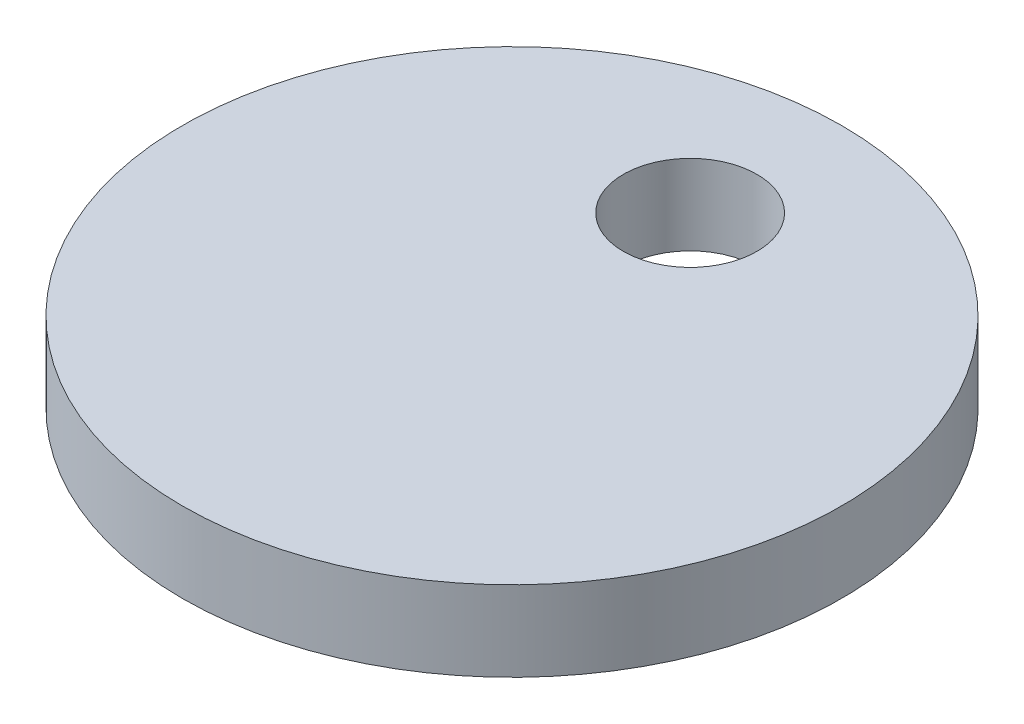
ISO-10303-21;
HEADER;
FILE_DESCRIPTION(('STEP AP214'),'2;1');
FILE_NAME('part.step','',(''),(''),'','','');
FILE_SCHEMA(('AUTOMOTIVE_DESIGN { 1 0 10303 214 1 1 1 1 }'));
ENDSEC;
DATA;
#1=APPLICATION_CONTEXT('core data for automotive mechanical design processes');
#2=APPLICATION_PROTOCOL_DEFINITION('international standard','automotive_design',2000,#1);
#3=PRODUCT_CONTEXT('',#1,'mechanical');
#4=PRODUCT('Part','Part','',(#3));
#5=PRODUCT_RELATED_PRODUCT_CATEGORY('part','',(#4));
#6=PRODUCT_DEFINITION_FORMATION('','',#4);
#7=PRODUCT_DEFINITION_CONTEXT('part definition',#1,'design');
#8=PRODUCT_DEFINITION('design','',#6,#7);
#9=PRODUCT_DEFINITION_SHAPE('','',#8);
#10=(LENGTH_UNIT() NAMED_UNIT(*) SI_UNIT(.MILLI.,.METRE.));
#11=(NAMED_UNIT(*) PLANE_ANGLE_UNIT() SI_UNIT($,.RADIAN.));
#12=(NAMED_UNIT(*) SI_UNIT($,.STERADIAN.) SOLID_ANGLE_UNIT());
#13=UNCERTAINTY_MEASURE_WITH_UNIT(LENGTH_MEASURE(1.E-05),#10,'distance_accuracy_value','');
#14=(GEOMETRIC_REPRESENTATION_CONTEXT(3) GLOBAL_UNCERTAINTY_ASSIGNED_CONTEXT((#13)) GLOBAL_UNIT_ASSIGNED_CONTEXT((#10,
#11,#12)) REPRESENTATION_CONTEXT('',''));
#15=CARTESIAN_POINT('',(0.,0.,0.));
#16=DIRECTION('',(0.,0.,1.));
#17=DIRECTION('',(1.,0.,0.));
#18=AXIS2_PLACEMENT_3D('',#15,#16,#17);
#19=CARTESIAN_POINT('',(0.,1.8,0.));
#20=DIRECTION('',(0.,-1.,0.));
#21=DIRECTION('',(0.,0.,-1.));
#22=AXIS2_PLACEMENT_3D('',#19,#20,#21);
#23=CYLINDRICAL_SURFACE('',#22,7.4);
#24=CARTESIAN_POINT('',(0.,1.8,0.));
#25=DIRECTION('',(0.,1.,0.));
#26=DIRECTION('',(0.,0.,1.));
#27=AXIS2_PLACEMENT_3D('',#24,#25,#26);
#28=CIRCLE('',#27,7.4);
#29=CARTESIAN_POINT('',(0.,1.8,7.4));
#30=VERTEX_POINT('',#29);
#31=EDGE_CURVE('E10',#30,#30,#28,.T.);
#32=ORIENTED_EDGE('',*,*,#31,.F.);
#33=EDGE_LOOP('',(#32));
#34=FACE_BOUND('',#33,.T.);
#35=CARTESIAN_POINT('',(0.,0.,0.));
#36=DIRECTION('',(0.,1.,0.));
#37=DIRECTION('',(0.,0.,1.));
#38=AXIS2_PLACEMENT_3D('',#35,#36,#37);
#39=CIRCLE('',#38,7.4);
#40=CARTESIAN_POINT('',(0.,0.,7.4));
#41=VERTEX_POINT('',#40);
#42=EDGE_CURVE('E41',#41,#41,#39,.T.);
#43=ORIENTED_EDGE('',*,*,#42,.T.);
#44=EDGE_LOOP('',(#43));
#45=FACE_BOUND('',#44,.T.);
#46=ADVANCED_FACE('F38',(#34,#45),#23,.T.);
#47=CARTESIAN_POINT('',(0.,1.8,0.));
#48=DIRECTION('',(0.,1.,0.));
#49=DIRECTION('',(0.,0.,1.));
#50=AXIS2_PLACEMENT_3D('',#47,#48,#49);
#51=PLANE('',#50);
#52=CARTESIAN_POINT('',(0.,1.8,-4.));
#53=DIRECTION('',(0.,1.,0.));
#54=DIRECTION('',(0.,0.,1.));
#55=AXIS2_PLACEMENT_3D('',#52,#53,#54);
#56=CIRCLE('',#55,1.5);
#57=CARTESIAN_POINT('',(0.,1.8,-2.5));
#58=VERTEX_POINT('',#57);
#59=EDGE_CURVE('E52',#58,#58,#56,.T.);
#60=ORIENTED_EDGE('',*,*,#59,.F.);
#61=EDGE_LOOP('',(#60));
#62=FACE_BOUND('',#61,.T.);
#63=ORIENTED_EDGE('',*,*,#31,.T.);
#64=EDGE_LOOP('',(#63));
#65=FACE_BOUND('',#64,.T.);
#66=ADVANCED_FACE('F69',(#62,#65),#51,.T.);
#67=CARTESIAN_POINT('',(0.,0.,0.));
#68=DIRECTION('',(0.,1.,0.));
#69=DIRECTION('',(0.,0.,1.));
#70=AXIS2_PLACEMENT_3D('',#67,#68,#69);
#71=PLANE('',#70);
#72=CARTESIAN_POINT('',(0.,0.,-4.));
#73=DIRECTION('',(0.,1.,0.));
#74=DIRECTION('',(0.,0.,1.));
#75=AXIS2_PLACEMENT_3D('',#72,#73,#74);
#76=CIRCLE('',#75,1.5);
#77=CARTESIAN_POINT('',(0.,0.,-2.5));
#78=VERTEX_POINT('',#77);
#79=EDGE_CURVE('E50',#78,#78,#76,.T.);
#80=ORIENTED_EDGE('',*,*,#79,.T.);
#81=EDGE_LOOP('',(#80));
#82=FACE_BOUND('',#81,.T.);
#83=ORIENTED_EDGE('',*,*,#42,.F.);
#84=EDGE_LOOP('',(#83));
#85=FACE_BOUND('',#84,.T.);
#86=ADVANCED_FACE('F60',(#82,#85),#71,.F.);
#87=CARTESIAN_POINT('',(0.,0.,-4.));
#88=DIRECTION('',(0.,1.,0.));
#89=DIRECTION('',(0.,0.,1.));
#90=AXIS2_PLACEMENT_3D('',#87,#88,#89);
#91=CYLINDRICAL_SURFACE('',#90,1.5);
#92=ORIENTED_EDGE('',*,*,#79,.F.);
#93=EDGE_LOOP('',(#92));
#94=FACE_BOUND('',#93,.T.);
#95=ORIENTED_EDGE('',*,*,#59,.T.);
#96=EDGE_LOOP('',(#95));
#97=FACE_BOUND('',#96,.T.);
#98=ADVANCED_FACE('F63',(#94,#97),#91,.F.);
#99=CLOSED_SHELL('',(#46,#66,#86,#98));
#100=MANIFOLD_SOLID_BREP('B2',#99);
#101=ADVANCED_BREP_SHAPE_REPRESENTATION('',(#18,#100),#14);
#102=SHAPE_DEFINITION_REPRESENTATION(#9,#101);
ENDSEC;
END-ISO-10303-21;
